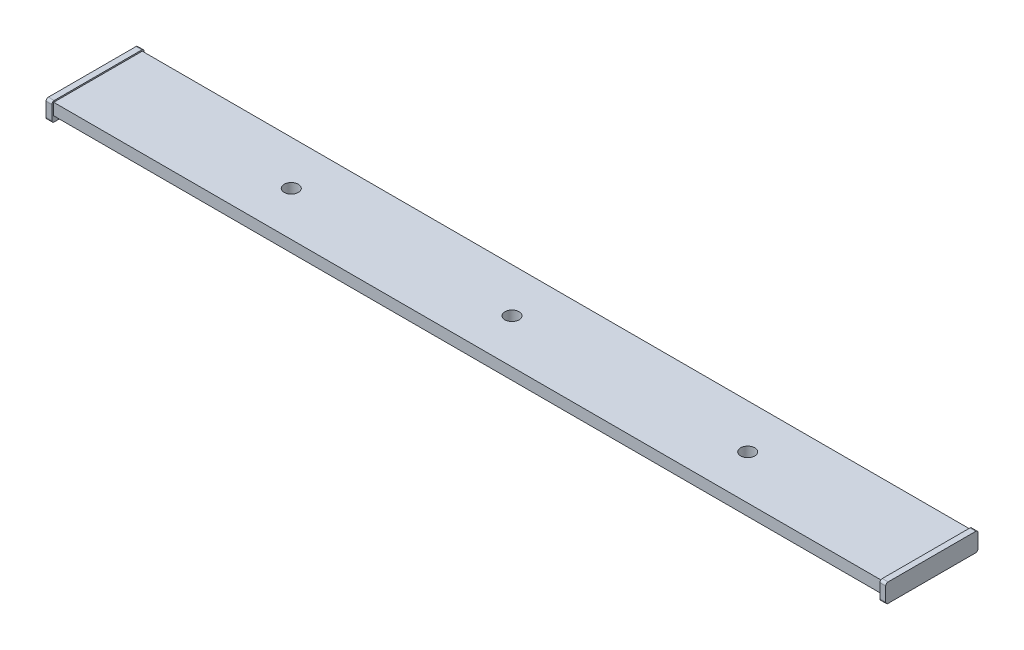
ISO-10303-21;
HEADER;
FILE_DESCRIPTION(('STEP AP214'),'2;1');
FILE_NAME('part.step','',(''),(''),'','','');
FILE_SCHEMA(('AUTOMOTIVE_DESIGN { 1 0 10303 214 1 1 1 1 }'));
ENDSEC;
DATA;
#1=APPLICATION_CONTEXT('core data for automotive mechanical design processes');
#2=APPLICATION_PROTOCOL_DEFINITION('international standard','automotive_design',2000,#1);
#3=PRODUCT_CONTEXT('',#1,'mechanical');
#4=PRODUCT('Part','Part','',(#3));
#5=PRODUCT_RELATED_PRODUCT_CATEGORY('part','',(#4));
#6=PRODUCT_DEFINITION_FORMATION('','',#4);
#7=PRODUCT_DEFINITION_CONTEXT('part definition',#1,'design');
#8=PRODUCT_DEFINITION('design','',#6,#7);
#9=PRODUCT_DEFINITION_SHAPE('','',#8);
#10=(LENGTH_UNIT() NAMED_UNIT(*) SI_UNIT(.MILLI.,.METRE.));
#11=(NAMED_UNIT(*) PLANE_ANGLE_UNIT() SI_UNIT($,.RADIAN.));
#12=(NAMED_UNIT(*) SI_UNIT($,.STERADIAN.) SOLID_ANGLE_UNIT());
#13=UNCERTAINTY_MEASURE_WITH_UNIT(LENGTH_MEASURE(1.E-05),#10,'distance_accuracy_value','');
#14=(GEOMETRIC_REPRESENTATION_CONTEXT(3) GLOBAL_UNCERTAINTY_ASSIGNED_CONTEXT((#13)) GLOBAL_UNIT_ASSIGNED_CONTEXT((#10,
#11,#12)) REPRESENTATION_CONTEXT('',''));
#15=CARTESIAN_POINT('',(0.,0.,0.));
#16=DIRECTION('',(0.,0.,1.));
#17=DIRECTION('',(1.,0.,0.));
#18=AXIS2_PLACEMENT_3D('',#15,#16,#17);
#19=CARTESIAN_POINT('',(0.,0.,0.));
#20=DIRECTION('',(0.,-1.,0.));
#21=DIRECTION('',(0.,0.,-1.));
#22=AXIS2_PLACEMENT_3D('',#19,#20,#21);
#23=PLANE('',#22);
#24=DIRECTION('',(1.,0.,0.));
#25=VECTOR('',#24,1.);
#26=CARTESIAN_POINT('',(-1800.,0.,189.84375));
#27=LINE('',#26,#25);
#28=CARTESIAN_POINT('',(-1775.,0.,189.84375));
#29=VERTEX_POINT('',#28);
#30=CARTESIAN_POINT('',(1775.,0.,189.84375));
#31=VERTEX_POINT('',#30);
#32=EDGE_CURVE('E547',#29,#31,#27,.T.);
#33=ORIENTED_EDGE('',*,*,#32,.F.);
#34=DIRECTION('',(0.,0.,-1.));
#35=VECTOR('',#34,1.);
#36=CARTESIAN_POINT('',(-1775.,0.,0.));
#37=LINE('',#36,#35);
#38=CARTESIAN_POINT('',(-1775.,0.,157.611800850735));
#39=VERTEX_POINT('',#38);
#40=EDGE_CURVE('E346',#29,#39,#37,.T.);
#41=ORIENTED_EDGE('',*,*,#40,.T.);
#42=DIRECTION('',(-1.,0.,0.));
#43=VECTOR('',#42,1.);
#44=CARTESIAN_POINT('',(0.,0.,157.611800850735));
#45=LINE('',#44,#43);
#46=CARTESIAN_POINT('',(1775.,0.,157.611800850736));
#47=VERTEX_POINT('',#46);
#48=EDGE_CURVE('E558',#47,#39,#45,.T.);
#49=ORIENTED_EDGE('',*,*,#48,.F.);
#50=DIRECTION('',(0.,0.,1.));
#51=VECTOR('',#50,1.);
#52=CARTESIAN_POINT('',(1775.,0.,0.));
#53=LINE('',#52,#51);
#54=EDGE_CURVE('E473',#47,#31,#53,.T.);
#55=ORIENTED_EDGE('',*,*,#54,.T.);
#56=EDGE_LOOP('',(#33,#41,#49,#55));
#57=FACE_BOUND('',#56,.T.);
#58=ADVANCED_FACE('F43',(#57),#23,.T.);
#59=DIRECTION('',(1.,0.,0.));
#60=VECTOR('',#59,1.);
#61=CARTESIAN_POINT('',(1853.85137292759,0.,-157.611800850736));
#62=LINE('',#61,#60);
#63=CARTESIAN_POINT('',(-1775.,0.,-157.611800850735));
#64=VERTEX_POINT('',#63);
#65=CARTESIAN_POINT('',(1775.,0.,-157.611800850736));
#66=VERTEX_POINT('',#65);
#67=EDGE_CURVE('E533',#64,#66,#62,.T.);
#68=ORIENTED_EDGE('',*,*,#67,.F.);
#69=DIRECTION('',(0.,0.,-1.));
#70=VECTOR('',#69,1.);
#71=CARTESIAN_POINT('',(-1775.,0.,0.));
#72=LINE('',#71,#70);
#73=CARTESIAN_POINT('',(-1775.,0.,-189.84375));
#74=VERTEX_POINT('',#73);
#75=EDGE_CURVE('E59',#64,#74,#72,.T.);
#76=ORIENTED_EDGE('',*,*,#75,.T.);
#77=DIRECTION('',(-1.,0.,0.));
#78=VECTOR('',#77,1.);
#79=CARTESIAN_POINT('',(-1800.,0.,-189.84375));
#80=LINE('',#79,#78);
#81=CARTESIAN_POINT('',(1775.,0.,-189.84375));
#82=VERTEX_POINT('',#81);
#83=EDGE_CURVE('E530',#82,#74,#80,.T.);
#84=ORIENTED_EDGE('',*,*,#83,.F.);
#85=DIRECTION('',(0.,0.,1.));
#86=VECTOR('',#85,1.);
#87=CARTESIAN_POINT('',(1775.,0.,0.));
#88=LINE('',#87,#86);
#89=EDGE_CURVE('E485',#82,#66,#88,.T.);
#90=ORIENTED_EDGE('',*,*,#89,.T.);
#91=EDGE_LOOP('',(#68,#76,#84,#90));
#92=FACE_BOUND('',#91,.T.);
#93=ADVANCED_FACE('F585',(#92),#23,.T.);
#94=CARTESIAN_POINT('',(-1800.,50.,-189.84375));
#95=DIRECTION('',(0.,0.,1.));
#96=DIRECTION('',(1.,0.,0.));
#97=AXIS2_PLACEMENT_3D('',#94,#95,#96);
#98=PLANE('',#97);
#99=DIRECTION('',(0.,-1.,0.));
#100=VECTOR('',#99,1.);
#101=CARTESIAN_POINT('',(-1775.,50.,-189.84375));
#102=LINE('',#101,#100);
#103=CARTESIAN_POINT('',(-1775.,50.,-189.84375));
#104=VERTEX_POINT('',#103);
#105=EDGE_CURVE('E361',#104,#74,#102,.T.);
#106=ORIENTED_EDGE('',*,*,#105,.F.);
#107=DIRECTION('',(-1.,0.,0.));
#108=VECTOR('',#107,1.);
#109=CARTESIAN_POINT('',(-1800.,50.,-189.84375));
#110=LINE('',#109,#108);
#111=CARTESIAN_POINT('',(1775.,50.,-189.84375));
#112=VERTEX_POINT('',#111);
#113=EDGE_CURVE('E542',#112,#104,#110,.T.);
#114=ORIENTED_EDGE('',*,*,#113,.F.);
#115=DIRECTION('',(0.,1.,0.));
#116=VECTOR('',#115,1.);
#117=CARTESIAN_POINT('',(1775.,50.,-189.84375));
#118=LINE('',#117,#116);
#119=EDGE_CURVE('E493',#82,#112,#118,.T.);
#120=ORIENTED_EDGE('',*,*,#119,.F.);
#121=ORIENTED_EDGE('',*,*,#83,.T.);
#122=EDGE_LOOP('',(#106,#114,#120,#121));
#123=FACE_BOUND('',#122,.T.);
#124=ADVANCED_FACE('F587',(#123),#98,.F.);
#125=CARTESIAN_POINT('',(-1800.,50.,189.84375));
#126=DIRECTION('',(0.,0.,-1.));
#127=DIRECTION('',(-1.,0.,0.));
#128=AXIS2_PLACEMENT_3D('',#125,#126,#127);
#129=PLANE('',#128);
#130=DIRECTION('',(0.,1.,0.));
#131=VECTOR('',#130,1.);
#132=CARTESIAN_POINT('',(-1775.,50.,189.84375));
#133=LINE('',#132,#131);
#134=CARTESIAN_POINT('',(-1775.,50.,189.84375));
#135=VERTEX_POINT('',#134);
#136=EDGE_CURVE('E67',#29,#135,#133,.T.);
#137=ORIENTED_EDGE('',*,*,#136,.F.);
#138=ORIENTED_EDGE('',*,*,#32,.T.);
#139=DIRECTION('',(0.,-1.,0.));
#140=VECTOR('',#139,1.);
#141=CARTESIAN_POINT('',(1775.,50.,189.84375));
#142=LINE('',#141,#140);
#143=CARTESIAN_POINT('',(1775.,50.,189.84375));
#144=VERTEX_POINT('',#143);
#145=EDGE_CURVE('E481',#144,#31,#142,.T.);
#146=ORIENTED_EDGE('',*,*,#145,.F.);
#147=DIRECTION('',(1.,0.,0.));
#148=VECTOR('',#147,1.);
#149=CARTESIAN_POINT('',(-1800.,50.,189.84375));
#150=LINE('',#149,#148);
#151=EDGE_CURVE('E546',#135,#144,#150,.T.);
#152=ORIENTED_EDGE('',*,*,#151,.F.);
#153=EDGE_LOOP('',(#137,#138,#146,#152));
#154=FACE_BOUND('',#153,.T.);
#155=ADVANCED_FACE('F593',(#154),#129,.F.);
#156=CARTESIAN_POINT('',(0.,50.,0.));
#157=DIRECTION('',(0.,-1.,0.));
#158=DIRECTION('',(0.,0.,-1.));
#159=AXIS2_PLACEMENT_3D('',#156,#157,#158);
#160=PLANE('',#159);
#161=CARTESIAN_POINT('',(1010.60365189735,50.,0.));
#162=DIRECTION('',(0.,-1.,0.));
#163=DIRECTION('',(0.,0.,-1.));
#164=AXIS2_PLACEMENT_3D('',#161,#162,#163);
#165=CIRCLE('',#164,30.3811390822481);
#166=CARTESIAN_POINT('',(1010.60365189735,50.,-30.3811390822481));
#167=VERTEX_POINT('',#166);
#168=EDGE_CURVE('E497',#167,#167,#165,.T.);
#169=ORIENTED_EDGE('',*,*,#168,.T.);
#170=EDGE_LOOP('',(#169));
#171=FACE_BOUND('',#170,.T.);
#172=CARTESIAN_POINT('',(-946.305515807381,50.,0.));
#173=DIRECTION('',(0.,-1.,0.));
#174=DIRECTION('',(0.,0.,-1.));
#175=AXIS2_PLACEMENT_3D('',#172,#173,#174);
#176=CIRCLE('',#175,30.3811390822481);
#177=CARTESIAN_POINT('',(-946.305515807381,50.,-30.3811390822481));
#178=VERTEX_POINT('',#177);
#179=EDGE_CURVE('E503',#178,#178,#176,.T.);
#180=ORIENTED_EDGE('',*,*,#179,.T.);
#181=EDGE_LOOP('',(#180));
#182=FACE_BOUND('',#181,.T.);
#183=CARTESIAN_POINT('',(0.,50.,0.));
#184=DIRECTION('',(0.,-1.,0.));
#185=DIRECTION('',(0.,0.,-1.));
#186=AXIS2_PLACEMENT_3D('',#183,#184,#185);
#187=CIRCLE('',#186,30.3811390822481);
#188=CARTESIAN_POINT('',(0.,50.,-30.3811390822481));
#189=VERTEX_POINT('',#188);
#190=EDGE_CURVE('E514',#189,#189,#187,.T.);
#191=ORIENTED_EDGE('',*,*,#190,.T.);
#192=EDGE_LOOP('',(#191));
#193=FACE_BOUND('',#192,.T.);
#194=DIRECTION('',(0.,0.,-1.));
#195=VECTOR('',#194,1.);
#196=CARTESIAN_POINT('',(-1775.,50.,0.));
#197=LINE('',#196,#195);
#198=EDGE_CURVE('E357',#135,#104,#197,.T.);
#199=ORIENTED_EDGE('',*,*,#198,.F.);
#200=ORIENTED_EDGE('',*,*,#151,.T.);
#201=DIRECTION('',(0.,0.,1.));
#202=VECTOR('',#201,1.);
#203=CARTESIAN_POINT('',(1775.,50.,0.));
#204=LINE('',#203,#202);
#205=EDGE_CURVE('E489',#112,#144,#204,.T.);
#206=ORIENTED_EDGE('',*,*,#205,.F.);
#207=ORIENTED_EDGE('',*,*,#113,.T.);
#208=EDGE_LOOP('',(#199,#200,#206,#207));
#209=FACE_BOUND('',#208,.T.);
#210=ADVANCED_FACE('F591',(#171,#182,#193,#209),#160,.F.);
#211=CARTESIAN_POINT('',(1010.60365189735,0.,0.));
#212=DIRECTION('',(0.,-1.,0.));
#213=DIRECTION('',(0.,0.,-1.));
#214=AXIS2_PLACEMENT_3D('',#211,#212,#213);
#215=CIRCLE('',#214,30.3811390822481);
#216=CARTESIAN_POINT('',(1010.60365189735,0.,-30.3811390822481));
#217=VERTEX_POINT('',#216);
#218=EDGE_CURVE('E507',#217,#217,#215,.T.);
#219=ORIENTED_EDGE('',*,*,#218,.F.);
#220=EDGE_LOOP('',(#219));
#221=FACE_BOUND('',#220,.T.);
#222=CARTESIAN_POINT('',(-946.305515807381,0.,0.));
#223=DIRECTION('',(0.,-1.,0.));
#224=DIRECTION('',(0.,0.,-1.));
#225=AXIS2_PLACEMENT_3D('',#222,#223,#224);
#226=CIRCLE('',#225,30.3811390822481);
#227=CARTESIAN_POINT('',(-946.305515807381,0.,-30.3811390822481));
#228=VERTEX_POINT('',#227);
#229=EDGE_CURVE('E498',#228,#228,#226,.T.);
#230=ORIENTED_EDGE('',*,*,#229,.F.);
#231=EDGE_LOOP('',(#230));
#232=FACE_BOUND('',#231,.T.);
#233=CARTESIAN_POINT('',(0.,0.,0.));
#234=DIRECTION('',(0.,-1.,0.));
#235=DIRECTION('',(0.,0.,-1.));
#236=AXIS2_PLACEMENT_3D('',#233,#234,#235);
#237=CIRCLE('',#236,30.3811390822481);
#238=CARTESIAN_POINT('',(0.,0.,-30.3811390822481));
#239=VERTEX_POINT('',#238);
#240=EDGE_CURVE('E502',#239,#239,#237,.T.);
#241=ORIENTED_EDGE('',*,*,#240,.F.);
#242=EDGE_LOOP('',(#241));
#243=FACE_BOUND('',#242,.T.);
#244=DIRECTION('',(1.,0.,0.));
#245=VECTOR('',#244,1.);
#246=CARTESIAN_POINT('',(1853.85137292759,0.,142.611800850736));
#247=LINE('',#246,#245);
#248=CARTESIAN_POINT('',(-1775.,0.,142.611800850735));
#249=VERTEX_POINT('',#248);
#250=CARTESIAN_POINT('',(1775.,0.,142.611800850736));
#251=VERTEX_POINT('',#250);
#252=EDGE_CURVE('E526',#249,#251,#247,.T.);
#253=ORIENTED_EDGE('',*,*,#252,.F.);
#254=DIRECTION('',(0.,0.,-1.));
#255=VECTOR('',#254,1.);
#256=CARTESIAN_POINT('',(-1775.,0.,0.));
#257=LINE('',#256,#255);
#258=CARTESIAN_POINT('',(-1775.,0.,-142.611800850735));
#259=VERTEX_POINT('',#258);
#260=EDGE_CURVE('E331',#249,#259,#257,.T.);
#261=ORIENTED_EDGE('',*,*,#260,.T.);
#262=DIRECTION('',(-1.,0.,0.));
#263=VECTOR('',#262,1.);
#264=CARTESIAN_POINT('',(0.,0.,-142.611800850735));
#265=LINE('',#264,#263);
#266=CARTESIAN_POINT('',(1775.,0.,-142.611800850736));
#267=VERTEX_POINT('',#266);
#268=EDGE_CURVE('E550',#267,#259,#265,.T.);
#269=ORIENTED_EDGE('',*,*,#268,.F.);
#270=DIRECTION('',(0.,0.,1.));
#271=VECTOR('',#270,1.);
#272=CARTESIAN_POINT('',(1775.,0.,0.));
#273=LINE('',#272,#271);
#274=EDGE_CURVE('E457',#267,#251,#273,.T.);
#275=ORIENTED_EDGE('',*,*,#274,.T.);
#276=EDGE_LOOP('',(#253,#261,#269,#275));
#277=FACE_BOUND('',#276,.T.);
#278=ADVANCED_FACE('F575',(#221,#232,#243,#277),#23,.T.);
#279=CARTESIAN_POINT('',(0.,25.,0.));
#280=DIRECTION('',(0.,1.,0.));
#281=DIRECTION('',(0.,0.,1.));
#282=AXIS2_PLACEMENT_3D('',#279,#280,#281);
#283=PLANE('',#282);
#284=DIRECTION('',(0.,0.,1.));
#285=VECTOR('',#284,1.);
#286=CARTESIAN_POINT('',(-1775.,25.,0.));
#287=LINE('',#286,#285);
#288=CARTESIAN_POINT('',(-1775.,25.,-157.611800850735));
#289=VERTEX_POINT('',#288);
#290=CARTESIAN_POINT('',(-1775.,25.,-142.611800850735));
#291=VERTEX_POINT('',#290);
#292=EDGE_CURVE('E342',#289,#291,#287,.T.);
#293=ORIENTED_EDGE('',*,*,#292,.F.);
#294=DIRECTION('',(1.,0.,0.));
#295=VECTOR('',#294,1.);
#296=CARTESIAN_POINT('',(1853.85137292759,25.,-157.611800850736));
#297=LINE('',#296,#295);
#298=CARTESIAN_POINT('',(1775.,25.,-157.611800850736));
#299=VERTEX_POINT('',#298);
#300=EDGE_CURVE('E536',#289,#299,#297,.T.);
#301=ORIENTED_EDGE('',*,*,#300,.T.);
#302=DIRECTION('',(0.,0.,-1.));
#303=VECTOR('',#302,1.);
#304=CARTESIAN_POINT('',(1775.,25.,0.));
#305=LINE('',#304,#303);
#306=CARTESIAN_POINT('',(1775.,25.,-142.611800850736));
#307=VERTEX_POINT('',#306);
#308=EDGE_CURVE('E469',#307,#299,#305,.T.);
#309=ORIENTED_EDGE('',*,*,#308,.F.);
#310=DIRECTION('',(-1.,0.,0.));
#311=VECTOR('',#310,1.);
#312=CARTESIAN_POINT('',(1853.85137292759,25.,-142.611800850736));
#313=LINE('',#312,#311);
#314=EDGE_CURVE('E518',#307,#291,#313,.T.);
#315=ORIENTED_EDGE('',*,*,#314,.T.);
#316=EDGE_LOOP('',(#293,#301,#309,#315));
#317=FACE_BOUND('',#316,.T.);
#318=ADVANCED_FACE('F581',(#317),#283,.F.);
#319=CARTESIAN_POINT('',(1853.85137292759,25.,-157.611800850736));
#320=DIRECTION('',(0.,0.,-1.));
#321=DIRECTION('',(-1.,0.,0.));
#322=AXIS2_PLACEMENT_3D('',#319,#320,#321);
#323=PLANE('',#322);
#324=DIRECTION('',(0.,1.,0.));
#325=VECTOR('',#324,1.);
#326=CARTESIAN_POINT('',(-1775.,25.,-157.611800850735));
#327=LINE('',#326,#325);
#328=EDGE_CURVE('E349',#64,#289,#327,.T.);
#329=ORIENTED_EDGE('',*,*,#328,.F.);
#330=ORIENTED_EDGE('',*,*,#67,.T.);
#331=DIRECTION('',(0.,-1.,0.));
#332=VECTOR('',#331,1.);
#333=CARTESIAN_POINT('',(1775.,25.,-157.611800850736));
#334=LINE('',#333,#332);
#335=EDGE_CURVE('E477',#299,#66,#334,.T.);
#336=ORIENTED_EDGE('',*,*,#335,.F.);
#337=ORIENTED_EDGE('',*,*,#300,.F.);
#338=EDGE_LOOP('',(#329,#330,#336,#337));
#339=FACE_BOUND('',#338,.T.);
#340=ADVANCED_FACE('F584',(#339),#323,.F.);
#341=CARTESIAN_POINT('',(1853.85137292759,25.,-142.611800850736));
#342=DIRECTION('',(0.,0.,1.));
#343=DIRECTION('',(1.,0.,0.));
#344=AXIS2_PLACEMENT_3D('',#341,#342,#343);
#345=PLANE('',#344);
#346=DIRECTION('',(0.,-1.,0.));
#347=VECTOR('',#346,1.);
#348=CARTESIAN_POINT('',(-1775.,25.,-142.611800850735));
#349=LINE('',#348,#347);
#350=EDGE_CURVE('E338',#291,#259,#349,.T.);
#351=ORIENTED_EDGE('',*,*,#350,.F.);
#352=ORIENTED_EDGE('',*,*,#314,.F.);
#353=DIRECTION('',(0.,1.,0.));
#354=VECTOR('',#353,1.);
#355=CARTESIAN_POINT('',(1775.,25.,-142.611800850736));
#356=LINE('',#355,#354);
#357=EDGE_CURVE('E465',#267,#307,#356,.T.);
#358=ORIENTED_EDGE('',*,*,#357,.F.);
#359=ORIENTED_EDGE('',*,*,#268,.T.);
#360=EDGE_LOOP('',(#351,#352,#358,#359));
#361=FACE_BOUND('',#360,.T.);
#362=ADVANCED_FACE('F577',(#361),#345,.F.);
#363=CARTESIAN_POINT('',(0.,25.,0.));
#364=DIRECTION('',(0.,1.,0.));
#365=DIRECTION('',(0.,0.,1.));
#366=AXIS2_PLACEMENT_3D('',#363,#364,#365);
#367=PLANE('',#366);
#368=DIRECTION('',(0.,0.,1.));
#369=VECTOR('',#368,1.);
#370=CARTESIAN_POINT('',(-1775.,25.,0.));
#371=LINE('',#370,#369);
#372=CARTESIAN_POINT('',(-1775.,25.,142.611800850735));
#373=VERTEX_POINT('',#372);
#374=CARTESIAN_POINT('',(-1775.,25.,157.611800850735));
#375=VERTEX_POINT('',#374);
#376=EDGE_CURVE('E305',#373,#375,#371,.T.);
#377=ORIENTED_EDGE('',*,*,#376,.F.);
#378=DIRECTION('',(1.,0.,0.));
#379=VECTOR('',#378,1.);
#380=CARTESIAN_POINT('',(1853.85137292759,25.,142.611800850736));
#381=LINE('',#380,#379);
#382=CARTESIAN_POINT('',(1775.,25.,142.611800850736));
#383=VERTEX_POINT('',#382);
#384=EDGE_CURVE('E522',#373,#383,#381,.T.);
#385=ORIENTED_EDGE('',*,*,#384,.T.);
#386=DIRECTION('',(0.,0.,-1.));
#387=VECTOR('',#386,1.);
#388=CARTESIAN_POINT('',(1775.,25.,0.));
#389=LINE('',#388,#387);
#390=CARTESIAN_POINT('',(1775.,25.,157.611800850736));
#391=VERTEX_POINT('',#390);
#392=EDGE_CURVE('E433',#391,#383,#389,.T.);
#393=ORIENTED_EDGE('',*,*,#392,.F.);
#394=DIRECTION('',(-1.,0.,0.));
#395=VECTOR('',#394,1.);
#396=CARTESIAN_POINT('',(1853.85137292759,25.,157.611800850736));
#397=LINE('',#396,#395);
#398=EDGE_CURVE('E525',#391,#375,#397,.T.);
#399=ORIENTED_EDGE('',*,*,#398,.T.);
#400=EDGE_LOOP('',(#377,#385,#393,#399));
#401=FACE_BOUND('',#400,.T.);
#402=ADVANCED_FACE('F601',(#401),#367,.F.);
#403=CARTESIAN_POINT('',(1853.85137292759,25.,157.611800850736));
#404=DIRECTION('',(0.,0.,1.));
#405=DIRECTION('',(1.,0.,0.));
#406=AXIS2_PLACEMENT_3D('',#403,#404,#405);
#407=PLANE('',#406);
#408=DIRECTION('',(0.,-1.,0.));
#409=VECTOR('',#408,1.);
#410=CARTESIAN_POINT('',(-1775.,25.,157.611800850735));
#411=LINE('',#410,#409);
#412=EDGE_CURVE('E334',#375,#39,#411,.T.);
#413=ORIENTED_EDGE('',*,*,#412,.F.);
#414=ORIENTED_EDGE('',*,*,#398,.F.);
#415=DIRECTION('',(0.,1.,0.));
#416=VECTOR('',#415,1.);
#417=CARTESIAN_POINT('',(1775.,25.,157.611800850736));
#418=LINE('',#417,#416);
#419=EDGE_CURVE('E461',#47,#391,#418,.T.);
#420=ORIENTED_EDGE('',*,*,#419,.F.);
#421=ORIENTED_EDGE('',*,*,#48,.T.);
#422=EDGE_LOOP('',(#413,#414,#420,#421));
#423=FACE_BOUND('',#422,.T.);
#424=ADVANCED_FACE('F598',(#423),#407,.F.);
#425=CARTESIAN_POINT('',(1853.85137292759,25.,142.611800850736));
#426=DIRECTION('',(0.,0.,-1.));
#427=DIRECTION('',(-1.,0.,0.));
#428=AXIS2_PLACEMENT_3D('',#425,#426,#427);
#429=PLANE('',#428);
#430=DIRECTION('',(0.,1.,0.));
#431=VECTOR('',#430,1.);
#432=CARTESIAN_POINT('',(-1775.,25.,142.611800850735));
#433=LINE('',#432,#431);
#434=EDGE_CURVE('E11',#249,#373,#433,.T.);
#435=ORIENTED_EDGE('',*,*,#434,.F.);
#436=ORIENTED_EDGE('',*,*,#252,.T.);
#437=DIRECTION('',(0.,-1.,0.));
#438=VECTOR('',#437,1.);
#439=CARTESIAN_POINT('',(1775.,25.,142.611800850736));
#440=LINE('',#439,#438);
#441=EDGE_CURVE('E52',#383,#251,#440,.T.);
#442=ORIENTED_EDGE('',*,*,#441,.F.);
#443=ORIENTED_EDGE('',*,*,#384,.F.);
#444=EDGE_LOOP('',(#435,#436,#442,#443));
#445=FACE_BOUND('',#444,.T.);
#446=ADVANCED_FACE('F569',(#445),#429,.F.);
#447=CARTESIAN_POINT('',(0.,50.,0.));
#448=DIRECTION('',(0.,-1.,0.));
#449=DIRECTION('',(0.,0.,-1.));
#450=AXIS2_PLACEMENT_3D('',#447,#448,#449);
#451=CYLINDRICAL_SURFACE('',#450,30.3811390822481);
#452=ORIENTED_EDGE('',*,*,#190,.F.);
#453=EDGE_LOOP('',(#452));
#454=FACE_BOUND('',#453,.T.);
#455=ORIENTED_EDGE('',*,*,#240,.T.);
#456=EDGE_LOOP('',(#455));
#457=FACE_BOUND('',#456,.T.);
#458=ADVANCED_FACE('F632',(#454,#457),#451,.F.);
#459=CARTESIAN_POINT('',(-946.305515807381,50.,0.));
#460=DIRECTION('',(0.,-1.,0.));
#461=DIRECTION('',(0.,0.,-1.));
#462=AXIS2_PLACEMENT_3D('',#459,#460,#461);
#463=CYLINDRICAL_SURFACE('',#462,30.3811390822481);
#464=ORIENTED_EDGE('',*,*,#179,.F.);
#465=EDGE_LOOP('',(#464));
#466=FACE_BOUND('',#465,.T.);
#467=ORIENTED_EDGE('',*,*,#229,.T.);
#468=EDGE_LOOP('',(#467));
#469=FACE_BOUND('',#468,.T.);
#470=ADVANCED_FACE('F634',(#466,#469),#463,.F.);
#471=CARTESIAN_POINT('',(1010.60365189735,50.,0.));
#472=DIRECTION('',(0.,-1.,0.));
#473=DIRECTION('',(0.,0.,-1.));
#474=AXIS2_PLACEMENT_3D('',#471,#472,#473);
#475=CYLINDRICAL_SURFACE('',#474,30.3811390822481);
#476=ORIENTED_EDGE('',*,*,#168,.F.);
#477=EDGE_LOOP('',(#476));
#478=FACE_BOUND('',#477,.T.);
#479=ORIENTED_EDGE('',*,*,#218,.T.);
#480=EDGE_LOOP('',(#479));
#481=FACE_BOUND('',#480,.T.);
#482=ADVANCED_FACE('F640',(#478,#481),#475,.F.);
#483=CARTESIAN_POINT('',(1775.,-14.1904561773228,-187.814440115148));
#484=DIRECTION('',(1.,0.,0.));
#485=DIRECTION('',(0.,0.,-1.));
#486=AXIS2_PLACEMENT_3D('',#483,#484,#485);
#487=PLANE('',#486);
#488=CARTESIAN_POINT('',(1775.,-14.1904561773228,-187.814440115148));
#489=DIRECTION('',(1.,0.,0.));
#490=DIRECTION('',(0.,0.,-1.));
#491=AXIS2_PLACEMENT_3D('',#488,#489,#490);
#492=CIRCLE('',#491,9.99999999999999);
#493=CARTESIAN_POINT('',(1775.,-24.1904561773228,-187.814440115148));
#494=VERTEX_POINT('',#493);
#495=CARTESIAN_POINT('',(1775.,-14.1904561773228,-197.814440115148));
#496=VERTEX_POINT('',#495);
#497=EDGE_CURVE('E366',#494,#496,#492,.T.);
#498=ORIENTED_EDGE('',*,*,#497,.F.);
#499=DIRECTION('',(0.,0.,-1.));
#500=VECTOR('',#499,1.);
#501=CARTESIAN_POINT('',(1775.,-24.1904561773228,187.814440115148));
#502=LINE('',#501,#500);
#503=CARTESIAN_POINT('',(1775.,-24.1904561773228,187.814440115148));
#504=VERTEX_POINT('',#503);
#505=EDGE_CURVE('E395',#504,#494,#502,.T.);
#506=ORIENTED_EDGE('',*,*,#505,.F.);
#507=CARTESIAN_POINT('',(1775.,-14.1904561773228,187.814440115148));
#508=DIRECTION('',(1.,0.,0.));
#509=DIRECTION('',(0.,0.,1.));
#510=AXIS2_PLACEMENT_3D('',#507,#508,#509);
#511=CIRCLE('',#510,10.);
#512=CARTESIAN_POINT('',(1775.,-14.1904561773228,197.814440115148));
#513=VERTEX_POINT('',#512);
#514=EDGE_CURVE('E391',#513,#504,#511,.T.);
#515=ORIENTED_EDGE('',*,*,#514,.F.);
#516=DIRECTION('',(0.,-1.,0.));
#517=VECTOR('',#516,1.);
#518=CARTESIAN_POINT('',(1775.,-14.1904561773228,197.814440115148));
#519=LINE('',#518,#517);
#520=CARTESIAN_POINT('',(1775.,45.6811638734017,197.814440115148));
#521=VERTEX_POINT('',#520);
#522=EDGE_CURVE('E387',#521,#513,#519,.T.);
#523=ORIENTED_EDGE('',*,*,#522,.F.);
#524=CARTESIAN_POINT('',(1775.,45.6811638734017,187.814440115148));
#525=DIRECTION('',(1.,0.,0.));
#526=DIRECTION('',(0.,0.,1.));
#527=AXIS2_PLACEMENT_3D('',#524,#525,#526);
#528=CIRCLE('',#527,10.);
#529=CARTESIAN_POINT('',(1775.,55.6811638734017,187.814440115148));
#530=VERTEX_POINT('',#529);
#531=EDGE_CURVE('E383',#530,#521,#528,.T.);
#532=ORIENTED_EDGE('',*,*,#531,.F.);
#533=DIRECTION('',(0.,0.,1.));
#534=VECTOR('',#533,1.);
#535=CARTESIAN_POINT('',(1775.,55.6811638734017,187.814440115148));
#536=LINE('',#535,#534);
#537=CARTESIAN_POINT('',(1775.,55.6811638734017,-187.814440115148));
#538=VERTEX_POINT('',#537);
#539=EDGE_CURVE('E379',#538,#530,#536,.T.);
#540=ORIENTED_EDGE('',*,*,#539,.F.);
#541=CARTESIAN_POINT('',(1775.,45.6811638734017,-187.814440115148));
#542=DIRECTION('',(1.,0.,0.));
#543=DIRECTION('',(0.,0.,1.));
#544=AXIS2_PLACEMENT_3D('',#541,#542,#543);
#545=CIRCLE('',#544,10.);
#546=CARTESIAN_POINT('',(1775.,45.6811638734017,-197.814440115148));
#547=VERTEX_POINT('',#546);
#548=EDGE_CURVE('E375',#547,#538,#545,.T.);
#549=ORIENTED_EDGE('',*,*,#548,.F.);
#550=DIRECTION('',(0.,1.,0.));
#551=VECTOR('',#550,1.);
#552=CARTESIAN_POINT('',(1775.,-14.1904561773228,-197.814440115148));
#553=LINE('',#552,#551);
#554=EDGE_CURVE('E370',#496,#547,#553,.T.);
#555=ORIENTED_EDGE('',*,*,#554,.F.);
#556=EDGE_LOOP('',(#498,#506,#515,#523,#532,#540,#549,#555));
#557=FACE_BOUND('',#556,.T.);
#558=ORIENTED_EDGE('',*,*,#89,.F.);
#559=ORIENTED_EDGE('',*,*,#119,.T.);
#560=ORIENTED_EDGE('',*,*,#205,.T.);
#561=ORIENTED_EDGE('',*,*,#145,.T.);
#562=ORIENTED_EDGE('',*,*,#54,.F.);
#563=ORIENTED_EDGE('',*,*,#419,.T.);
#564=ORIENTED_EDGE('',*,*,#392,.T.);
#565=ORIENTED_EDGE('',*,*,#441,.T.);
#566=ORIENTED_EDGE('',*,*,#274,.F.);
#567=ORIENTED_EDGE('',*,*,#357,.T.);
#568=ORIENTED_EDGE('',*,*,#308,.T.);
#569=ORIENTED_EDGE('',*,*,#335,.T.);
#570=EDGE_LOOP('',(#558,#559,#560,#561,#562,#563,#564,#565,#566,#567,#568,#569));
#571=FACE_BOUND('',#570,.T.);
#572=ADVANCED_FACE('F567',(#557,#571),#487,.F.);
#573=CARTESIAN_POINT('',(1775.,-14.1904561773228,-187.814440115148));
#574=DIRECTION('',(1.,0.,0.));
#575=DIRECTION('',(0.,0.,-1.));
#576=AXIS2_PLACEMENT_3D('',#573,#574,#575);
#577=CYLINDRICAL_SURFACE('',#576,9.99999999999999);
#578=CARTESIAN_POINT('',(1800.,-14.1904561773228,-187.814440115148));
#579=DIRECTION('',(1.,0.,0.));
#580=DIRECTION('',(0.,0.,-1.));
#581=AXIS2_PLACEMENT_3D('',#578,#579,#580);
#582=CIRCLE('',#581,9.99999999999999);
#583=CARTESIAN_POINT('',(1800.,-24.1904561773228,-187.814440115148));
#584=VERTEX_POINT('',#583);
#585=CARTESIAN_POINT('',(1800.,-14.1904561773228,-197.814440115148));
#586=VERTEX_POINT('',#585);
#587=EDGE_CURVE('E365',#584,#586,#582,.T.);
#588=ORIENTED_EDGE('',*,*,#587,.F.);
#589=DIRECTION('',(1.,0.,0.));
#590=VECTOR('',#589,1.);
#591=CARTESIAN_POINT('',(1775.,-24.1904561773228,-187.814440115148));
#592=LINE('',#591,#590);
#593=EDGE_CURVE('E430',#494,#584,#592,.T.);
#594=ORIENTED_EDGE('',*,*,#593,.F.);
#595=ORIENTED_EDGE('',*,*,#497,.T.);
#596=DIRECTION('',(1.,0.,0.));
#597=VECTOR('',#596,1.);
#598=CARTESIAN_POINT('',(1775.,-14.1904561773228,-197.814440115148));
#599=LINE('',#598,#597);
#600=EDGE_CURVE('E399',#496,#586,#599,.T.);
#601=ORIENTED_EDGE('',*,*,#600,.T.);
#602=EDGE_LOOP('',(#588,#594,#595,#601));
#603=FACE_BOUND('',#602,.T.);
#604=ADVANCED_FACE('F649',(#603),#577,.T.);
#605=CARTESIAN_POINT('',(1775.,-24.1904561773228,187.814440115148));
#606=DIRECTION('',(0.,-1.,0.));
#607=DIRECTION('',(0.,0.,-1.));
#608=AXIS2_PLACEMENT_3D('',#605,#606,#607);
#609=PLANE('',#608);
#610=DIRECTION('',(0.,0.,-1.));
#611=VECTOR('',#610,1.);
#612=CARTESIAN_POINT('',(1800.,-24.1904561773228,187.814440115148));
#613=LINE('',#612,#611);
#614=CARTESIAN_POINT('',(1800.,-24.1904561773228,187.814440115148));
#615=VERTEX_POINT('',#614);
#616=EDGE_CURVE('E371',#615,#584,#613,.T.);
#617=ORIENTED_EDGE('',*,*,#616,.F.);
#618=DIRECTION('',(1.,0.,0.));
#619=VECTOR('',#618,1.);
#620=CARTESIAN_POINT('',(1775.,-24.1904561773228,187.814440115148));
#621=LINE('',#620,#619);
#622=EDGE_CURVE('E434',#504,#615,#621,.T.);
#623=ORIENTED_EDGE('',*,*,#622,.F.);
#624=ORIENTED_EDGE('',*,*,#505,.T.);
#625=ORIENTED_EDGE('',*,*,#593,.T.);
#626=EDGE_LOOP('',(#617,#623,#624,#625));
#627=FACE_BOUND('',#626,.T.);
#628=ADVANCED_FACE('F652',(#627),#609,.T.);
#629=CARTESIAN_POINT('',(1775.,-14.1904561773228,187.814440115148));
#630=DIRECTION('',(1.,0.,0.));
#631=DIRECTION('',(0.,0.,-1.));
#632=AXIS2_PLACEMENT_3D('',#629,#630,#631);
#633=CYLINDRICAL_SURFACE('',#632,10.);
#634=CARTESIAN_POINT('',(1800.,-14.1904561773228,187.814440115148));
#635=DIRECTION('',(1.,0.,0.));
#636=DIRECTION('',(0.,0.,1.));
#637=AXIS2_PLACEMENT_3D('',#634,#635,#636);
#638=CIRCLE('',#637,10.);
#639=CARTESIAN_POINT('',(1800.,-14.1904561773228,197.814440115148));
#640=VERTEX_POINT('',#639);
#641=EDGE_CURVE('E423',#640,#615,#638,.T.);
#642=ORIENTED_EDGE('',*,*,#641,.F.);
#643=DIRECTION('',(1.,0.,0.));
#644=VECTOR('',#643,1.);
#645=CARTESIAN_POINT('',(1775.,-14.1904561773228,197.814440115148));
#646=LINE('',#645,#644);
#647=EDGE_CURVE('E437',#513,#640,#646,.T.);
#648=ORIENTED_EDGE('',*,*,#647,.F.);
#649=ORIENTED_EDGE('',*,*,#514,.T.);
#650=ORIENTED_EDGE('',*,*,#622,.T.);
#651=EDGE_LOOP('',(#642,#648,#649,#650));
#652=FACE_BOUND('',#651,.T.);
#653=ADVANCED_FACE('F673',(#652),#633,.T.);
#654=CARTESIAN_POINT('',(1775.,-14.1904561773228,197.814440115148));
#655=DIRECTION('',(0.,0.,1.));
#656=DIRECTION('',(1.,0.,0.));
#657=AXIS2_PLACEMENT_3D('',#654,#655,#656);
#658=PLANE('',#657);
#659=DIRECTION('',(0.,-1.,0.));
#660=VECTOR('',#659,1.);
#661=CARTESIAN_POINT('',(1800.,-14.1904561773228,197.814440115148));
#662=LINE('',#661,#660);
#663=CARTESIAN_POINT('',(1800.,45.6811638734017,197.814440115148));
#664=VERTEX_POINT('',#663);
#665=EDGE_CURVE('E419',#664,#640,#662,.T.);
#666=ORIENTED_EDGE('',*,*,#665,.F.);
#667=DIRECTION('',(1.,0.,0.));
#668=VECTOR('',#667,1.);
#669=CARTESIAN_POINT('',(1775.,45.6811638734017,197.814440115148));
#670=LINE('',#669,#668);
#671=EDGE_CURVE('E440',#521,#664,#670,.T.);
#672=ORIENTED_EDGE('',*,*,#671,.F.);
#673=ORIENTED_EDGE('',*,*,#522,.T.);
#674=ORIENTED_EDGE('',*,*,#647,.T.);
#675=EDGE_LOOP('',(#666,#672,#673,#674));
#676=FACE_BOUND('',#675,.T.);
#677=ADVANCED_FACE('F669',(#676),#658,.T.);
#678=CARTESIAN_POINT('',(1775.,45.6811638734017,187.814440115148));
#679=DIRECTION('',(1.,0.,0.));
#680=DIRECTION('',(0.,0.,-1.));
#681=AXIS2_PLACEMENT_3D('',#678,#679,#680);
#682=CYLINDRICAL_SURFACE('',#681,10.);
#683=CARTESIAN_POINT('',(1800.,45.6811638734017,187.814440115148));
#684=DIRECTION('',(1.,0.,0.));
#685=DIRECTION('',(0.,0.,1.));
#686=AXIS2_PLACEMENT_3D('',#683,#684,#685);
#687=CIRCLE('',#686,10.);
#688=CARTESIAN_POINT('',(1800.,55.6811638734017,187.814440115148));
#689=VERTEX_POINT('',#688);
#690=EDGE_CURVE('E415',#689,#664,#687,.T.);
#691=ORIENTED_EDGE('',*,*,#690,.F.);
#692=DIRECTION('',(1.,0.,0.));
#693=VECTOR('',#692,1.);
#694=CARTESIAN_POINT('',(1775.,55.6811638734017,187.814440115148));
#695=LINE('',#694,#693);
#696=EDGE_CURVE('E443',#530,#689,#695,.T.);
#697=ORIENTED_EDGE('',*,*,#696,.F.);
#698=ORIENTED_EDGE('',*,*,#531,.T.);
#699=ORIENTED_EDGE('',*,*,#671,.T.);
#700=EDGE_LOOP('',(#691,#697,#698,#699));
#701=FACE_BOUND('',#700,.T.);
#702=ADVANCED_FACE('F665',(#701),#682,.T.);
#703=CARTESIAN_POINT('',(1775.,55.6811638734017,187.814440115148));
#704=DIRECTION('',(0.,1.,0.));
#705=DIRECTION('',(0.,0.,1.));
#706=AXIS2_PLACEMENT_3D('',#703,#704,#705);
#707=PLANE('',#706);
#708=DIRECTION('',(0.,0.,1.));
#709=VECTOR('',#708,1.);
#710=CARTESIAN_POINT('',(1800.,55.6811638734017,187.814440115148));
#711=LINE('',#710,#709);
#712=CARTESIAN_POINT('',(1800.,55.6811638734017,-187.814440115148));
#713=VERTEX_POINT('',#712);
#714=EDGE_CURVE('E411',#713,#689,#711,.T.);
#715=ORIENTED_EDGE('',*,*,#714,.F.);
#716=DIRECTION('',(1.,0.,0.));
#717=VECTOR('',#716,1.);
#718=CARTESIAN_POINT('',(1775.,55.6811638734017,-187.814440115148));
#719=LINE('',#718,#717);
#720=EDGE_CURVE('E446',#538,#713,#719,.T.);
#721=ORIENTED_EDGE('',*,*,#720,.F.);
#722=ORIENTED_EDGE('',*,*,#539,.T.);
#723=ORIENTED_EDGE('',*,*,#696,.T.);
#724=EDGE_LOOP('',(#715,#721,#722,#723));
#725=FACE_BOUND('',#724,.T.);
#726=ADVANCED_FACE('F661',(#725),#707,.T.);
#727=CARTESIAN_POINT('',(1775.,45.6811638734017,-187.814440115148));
#728=DIRECTION('',(1.,0.,0.));
#729=DIRECTION('',(0.,0.,-1.));
#730=AXIS2_PLACEMENT_3D('',#727,#728,#729);
#731=CYLINDRICAL_SURFACE('',#730,10.);
#732=CARTESIAN_POINT('',(1800.,45.6811638734017,-187.814440115148));
#733=DIRECTION('',(1.,0.,0.));
#734=DIRECTION('',(0.,0.,1.));
#735=AXIS2_PLACEMENT_3D('',#732,#733,#734);
#736=CIRCLE('',#735,10.);
#737=CARTESIAN_POINT('',(1800.,45.6811638734017,-197.814440115148));
#738=VERTEX_POINT('',#737);
#739=EDGE_CURVE('E407',#738,#713,#736,.T.);
#740=ORIENTED_EDGE('',*,*,#739,.F.);
#741=DIRECTION('',(1.,0.,0.));
#742=VECTOR('',#741,1.);
#743=CARTESIAN_POINT('',(1775.,45.6811638734017,-197.814440115148));
#744=LINE('',#743,#742);
#745=EDGE_CURVE('E449',#547,#738,#744,.T.);
#746=ORIENTED_EDGE('',*,*,#745,.F.);
#747=ORIENTED_EDGE('',*,*,#548,.T.);
#748=ORIENTED_EDGE('',*,*,#720,.T.);
#749=EDGE_LOOP('',(#740,#746,#747,#748));
#750=FACE_BOUND('',#749,.T.);
#751=ADVANCED_FACE('F657',(#750),#731,.T.);
#752=CARTESIAN_POINT('',(1775.,-14.1904561773228,-197.814440115148));
#753=DIRECTION('',(0.,0.,-1.));
#754=DIRECTION('',(-1.,0.,0.));
#755=AXIS2_PLACEMENT_3D('',#752,#753,#754);
#756=PLANE('',#755);
#757=DIRECTION('',(0.,1.,0.));
#758=VECTOR('',#757,1.);
#759=CARTESIAN_POINT('',(1800.,-14.1904561773228,-197.814440115148));
#760=LINE('',#759,#758);
#761=EDGE_CURVE('E403',#586,#738,#760,.T.);
#762=ORIENTED_EDGE('',*,*,#761,.F.);
#763=ORIENTED_EDGE('',*,*,#600,.F.);
#764=ORIENTED_EDGE('',*,*,#554,.T.);
#765=ORIENTED_EDGE('',*,*,#745,.T.);
#766=EDGE_LOOP('',(#762,#763,#764,#765));
#767=FACE_BOUND('',#766,.T.);
#768=ADVANCED_FACE('F654',(#767),#756,.T.);
#769=CARTESIAN_POINT('',(1800.,50.,189.84375));
#770=DIRECTION('',(-1.,0.,0.));
#771=DIRECTION('',(0.,0.,1.));
#772=AXIS2_PLACEMENT_3D('',#769,#770,#771);
#773=PLANE('',#772);
#774=ORIENTED_EDGE('',*,*,#587,.T.);
#775=ORIENTED_EDGE('',*,*,#761,.T.);
#776=ORIENTED_EDGE('',*,*,#739,.T.);
#777=ORIENTED_EDGE('',*,*,#714,.T.);
#778=ORIENTED_EDGE('',*,*,#690,.T.);
#779=ORIENTED_EDGE('',*,*,#665,.T.);
#780=ORIENTED_EDGE('',*,*,#641,.T.);
#781=ORIENTED_EDGE('',*,*,#616,.T.);
#782=EDGE_LOOP('',(#774,#775,#776,#777,#778,#779,#780,#781));
#783=FACE_BOUND('',#782,.T.);
#784=ADVANCED_FACE('F45',(#783),#773,.F.);
#785=CARTESIAN_POINT('',(-1775.,-14.1904561773228,-187.814440115148));
#786=DIRECTION('',(-1.,0.,0.));
#787=DIRECTION('',(0.,0.,-1.));
#788=AXIS2_PLACEMENT_3D('',#785,#786,#787);
#789=PLANE('',#788);
#790=CARTESIAN_POINT('',(-1775.,-14.1904561773228,-187.814440115148));
#791=DIRECTION('',(1.,0.,0.));
#792=DIRECTION('',(0.,0.,-1.));
#793=AXIS2_PLACEMENT_3D('',#790,#791,#792);
#794=CIRCLE('',#793,9.99999999999999);
#795=CARTESIAN_POINT('',(-1775.,-24.1904561773228,-187.814440115148));
#796=VERTEX_POINT('',#795);
#797=CARTESIAN_POINT('',(-1775.,-14.1904561773228,-197.814440115148));
#798=VERTEX_POINT('',#797);
#799=EDGE_CURVE('E237',#796,#798,#794,.T.);
#800=ORIENTED_EDGE('',*,*,#799,.T.);
#801=DIRECTION('',(0.,1.,0.));
#802=VECTOR('',#801,1.);
#803=CARTESIAN_POINT('',(-1775.,-14.1904561773228,-197.814440115148));
#804=LINE('',#803,#802);
#805=CARTESIAN_POINT('',(-1775.,45.6811638734017,-197.814440115148));
#806=VERTEX_POINT('',#805);
#807=EDGE_CURVE('E256',#798,#806,#804,.T.);
#808=ORIENTED_EDGE('',*,*,#807,.T.);
#809=CARTESIAN_POINT('',(-1775.,45.6811638734017,-187.814440115148));
#810=DIRECTION('',(1.,0.,0.));
#811=DIRECTION('',(0.,0.,1.));
#812=AXIS2_PLACEMENT_3D('',#809,#810,#811);
#813=CIRCLE('',#812,10.);
#814=CARTESIAN_POINT('',(-1775.,55.6811638734017,-187.814440115148));
#815=VERTEX_POINT('',#814);
#816=EDGE_CURVE('E279',#806,#815,#813,.T.);
#817=ORIENTED_EDGE('',*,*,#816,.T.);
#818=DIRECTION('',(0.,0.,1.));
#819=VECTOR('',#818,1.);
#820=CARTESIAN_POINT('',(-1775.,55.6811638734017,187.814440115148));
#821=LINE('',#820,#819);
#822=CARTESIAN_POINT('',(-1775.,55.6811638734017,187.814440115148));
#823=VERTEX_POINT('',#822);
#824=EDGE_CURVE('E276',#815,#823,#821,.T.);
#825=ORIENTED_EDGE('',*,*,#824,.T.);
#826=CARTESIAN_POINT('',(-1775.,45.6811638734017,187.814440115148));
#827=DIRECTION('',(1.,0.,0.));
#828=DIRECTION('',(0.,0.,1.));
#829=AXIS2_PLACEMENT_3D('',#826,#827,#828);
#830=CIRCLE('',#829,10.);
#831=CARTESIAN_POINT('',(-1775.,45.6811638734017,197.814440115148));
#832=VERTEX_POINT('',#831);
#833=EDGE_CURVE('E273',#823,#832,#830,.T.);
#834=ORIENTED_EDGE('',*,*,#833,.T.);
#835=DIRECTION('',(0.,-1.,0.));
#836=VECTOR('',#835,1.);
#837=CARTESIAN_POINT('',(-1775.,-14.1904561773228,197.814440115148));
#838=LINE('',#837,#836);
#839=CARTESIAN_POINT('',(-1775.,-14.1904561773228,197.814440115148));
#840=VERTEX_POINT('',#839);
#841=EDGE_CURVE('E270',#832,#840,#838,.T.);
#842=ORIENTED_EDGE('',*,*,#841,.T.);
#843=CARTESIAN_POINT('',(-1775.,-14.1904561773228,187.814440115148));
#844=DIRECTION('',(1.,0.,0.));
#845=DIRECTION('',(0.,0.,1.));
#846=AXIS2_PLACEMENT_3D('',#843,#844,#845);
#847=CIRCLE('',#846,10.);
#848=CARTESIAN_POINT('',(-1775.,-24.1904561773228,187.814440115148));
#849=VERTEX_POINT('',#848);
#850=EDGE_CURVE('E240',#840,#849,#847,.T.);
#851=ORIENTED_EDGE('',*,*,#850,.T.);
#852=DIRECTION('',(0.,0.,-1.));
#853=VECTOR('',#852,1.);
#854=CARTESIAN_POINT('',(-1775.,-24.1904561773228,187.814440115148));
#855=LINE('',#854,#853);
#856=EDGE_CURVE('E232',#849,#796,#855,.T.);
#857=ORIENTED_EDGE('',*,*,#856,.T.);
#858=EDGE_LOOP('',(#800,#808,#817,#825,#834,#842,#851,#857));
#859=FACE_BOUND('',#858,.T.);
#860=ORIENTED_EDGE('',*,*,#198,.T.);
#861=ORIENTED_EDGE('',*,*,#105,.T.);
#862=ORIENTED_EDGE('',*,*,#75,.F.);
#863=ORIENTED_EDGE('',*,*,#328,.T.);
#864=ORIENTED_EDGE('',*,*,#292,.T.);
#865=ORIENTED_EDGE('',*,*,#350,.T.);
#866=ORIENTED_EDGE('',*,*,#260,.F.);
#867=ORIENTED_EDGE('',*,*,#434,.T.);
#868=ORIENTED_EDGE('',*,*,#376,.T.);
#869=ORIENTED_EDGE('',*,*,#412,.T.);
#870=ORIENTED_EDGE('',*,*,#40,.F.);
#871=ORIENTED_EDGE('',*,*,#136,.T.);
#872=EDGE_LOOP('',(#860,#861,#862,#863,#864,#865,#866,#867,#868,#869,#870,#871));
#873=FACE_BOUND('',#872,.T.);
#874=ADVANCED_FACE('F234',(#859,#873),#789,.F.);
#875=CARTESIAN_POINT('',(-1775.,-14.1904561773228,-187.814440115148));
#876=DIRECTION('',(-1.,0.,0.));
#877=DIRECTION('',(0.,0.,1.));
#878=AXIS2_PLACEMENT_3D('',#875,#876,#877);
#879=CYLINDRICAL_SURFACE('',#878,9.99999999999999);
#880=CARTESIAN_POINT('',(-1800.,-14.1904561773228,-187.814440115148));
#881=DIRECTION('',(1.,0.,0.));
#882=DIRECTION('',(0.,0.,-1.));
#883=AXIS2_PLACEMENT_3D('',#880,#881,#882);
#884=CIRCLE('',#883,9.99999999999999);
#885=CARTESIAN_POINT('',(-1800.,-24.1904561773228,-187.814440115148));
#886=VERTEX_POINT('',#885);
#887=CARTESIAN_POINT('',(-1800.,-14.1904561773228,-197.814440115148));
#888=VERTEX_POINT('',#887);
#889=EDGE_CURVE('E284',#886,#888,#884,.T.);
#890=ORIENTED_EDGE('',*,*,#889,.T.);
#891=DIRECTION('',(-1.,0.,0.));
#892=VECTOR('',#891,1.);
#893=CARTESIAN_POINT('',(-1775.,-14.1904561773228,-197.814440115148));
#894=LINE('',#893,#892);
#895=EDGE_CURVE('E260',#798,#888,#894,.T.);
#896=ORIENTED_EDGE('',*,*,#895,.F.);
#897=ORIENTED_EDGE('',*,*,#799,.F.);
#898=DIRECTION('',(-1.,0.,0.));
#899=VECTOR('',#898,1.);
#900=CARTESIAN_POINT('',(-1775.,-24.1904561773228,-187.814440115148));
#901=LINE('',#900,#899);
#902=EDGE_CURVE('E247',#796,#886,#901,.T.);
#903=ORIENTED_EDGE('',*,*,#902,.T.);
#904=EDGE_LOOP('',(#890,#896,#897,#903));
#905=FACE_BOUND('',#904,.T.);
#906=ADVANCED_FACE('F258',(#905),#879,.T.);
#907=CARTESIAN_POINT('',(-1775.,-14.1904561773228,-197.814440115148));
#908=DIRECTION('',(0.,0.,1.));
#909=DIRECTION('',(1.,0.,0.));
#910=AXIS2_PLACEMENT_3D('',#907,#908,#909);
#911=PLANE('',#910);
#912=DIRECTION('',(0.,1.,0.));
#913=VECTOR('',#912,1.);
#914=CARTESIAN_POINT('',(-1800.,-14.1904561773228,-197.814440115148));
#915=LINE('',#914,#913);
#916=CARTESIAN_POINT('',(-1800.,45.6811638734017,-197.814440115148));
#917=VERTEX_POINT('',#916);
#918=EDGE_CURVE('E262',#888,#917,#915,.T.);
#919=ORIENTED_EDGE('',*,*,#918,.T.);
#920=DIRECTION('',(-1.,0.,0.));
#921=VECTOR('',#920,1.);
#922=CARTESIAN_POINT('',(-1775.,45.6811638734017,-197.814440115148));
#923=LINE('',#922,#921);
#924=EDGE_CURVE('E306',#806,#917,#923,.T.);
#925=ORIENTED_EDGE('',*,*,#924,.F.);
#926=ORIENTED_EDGE('',*,*,#807,.F.);
#927=ORIENTED_EDGE('',*,*,#895,.T.);
#928=EDGE_LOOP('',(#919,#925,#926,#927));
#929=FACE_BOUND('',#928,.T.);
#930=ADVANCED_FACE('F686',(#929),#911,.F.);
#931=CARTESIAN_POINT('',(-1775.,45.6811638734017,-187.814440115148));
#932=DIRECTION('',(-1.,0.,0.));
#933=DIRECTION('',(0.,0.,1.));
#934=AXIS2_PLACEMENT_3D('',#931,#932,#933);
#935=CYLINDRICAL_SURFACE('',#934,10.);
#936=CARTESIAN_POINT('',(-1800.,45.6811638734017,-187.814440115148));
#937=DIRECTION('',(1.,0.,0.));
#938=DIRECTION('',(0.,0.,1.));
#939=AXIS2_PLACEMENT_3D('',#936,#937,#938);
#940=CIRCLE('',#939,10.);
#941=CARTESIAN_POINT('',(-1800.,55.6811638734017,-187.814440115148));
#942=VERTEX_POINT('',#941);
#943=EDGE_CURVE('E265',#917,#942,#940,.T.);
#944=ORIENTED_EDGE('',*,*,#943,.T.);
#945=DIRECTION('',(-1.,0.,0.));
#946=VECTOR('',#945,1.);
#947=CARTESIAN_POINT('',(-1775.,55.6811638734017,-187.814440115148));
#948=LINE('',#947,#946);
#949=EDGE_CURVE('E310',#815,#942,#948,.T.);
#950=ORIENTED_EDGE('',*,*,#949,.F.);
#951=ORIENTED_EDGE('',*,*,#816,.F.);
#952=ORIENTED_EDGE('',*,*,#924,.T.);
#953=EDGE_LOOP('',(#944,#950,#951,#952));
#954=FACE_BOUND('',#953,.T.);
#955=ADVANCED_FACE('F705',(#954),#935,.T.);
#956=CARTESIAN_POINT('',(-1775.,55.6811638734017,187.814440115148));
#957=DIRECTION('',(0.,-1.,0.));
#958=DIRECTION('',(0.,0.,-1.));
#959=AXIS2_PLACEMENT_3D('',#956,#957,#958);
#960=PLANE('',#959);
#961=DIRECTION('',(0.,0.,1.));
#962=VECTOR('',#961,1.);
#963=CARTESIAN_POINT('',(-1800.,55.6811638734017,187.814440115148));
#964=LINE('',#963,#962);
#965=CARTESIAN_POINT('',(-1800.,55.6811638734017,187.814440115148));
#966=VERTEX_POINT('',#965);
#967=EDGE_CURVE('E298',#942,#966,#964,.T.);
#968=ORIENTED_EDGE('',*,*,#967,.T.);
#969=DIRECTION('',(-1.,0.,0.));
#970=VECTOR('',#969,1.);
#971=CARTESIAN_POINT('',(-1775.,55.6811638734017,187.814440115148));
#972=LINE('',#971,#970);
#973=EDGE_CURVE('E314',#823,#966,#972,.T.);
#974=ORIENTED_EDGE('',*,*,#973,.F.);
#975=ORIENTED_EDGE('',*,*,#824,.F.);
#976=ORIENTED_EDGE('',*,*,#949,.T.);
#977=EDGE_LOOP('',(#968,#974,#975,#976));
#978=FACE_BOUND('',#977,.T.);
#979=ADVANCED_FACE('F701',(#978),#960,.F.);
#980=CARTESIAN_POINT('',(-1775.,45.6811638734017,187.814440115148));
#981=DIRECTION('',(-1.,0.,0.));
#982=DIRECTION('',(0.,0.,1.));
#983=AXIS2_PLACEMENT_3D('',#980,#981,#982);
#984=CYLINDRICAL_SURFACE('',#983,10.);
#985=CARTESIAN_POINT('',(-1800.,45.6811638734017,187.814440115148));
#986=DIRECTION('',(1.,0.,0.));
#987=DIRECTION('',(0.,0.,1.));
#988=AXIS2_PLACEMENT_3D('',#985,#986,#987);
#989=CIRCLE('',#988,10.);
#990=CARTESIAN_POINT('',(-1800.,45.6811638734017,197.814440115148));
#991=VERTEX_POINT('',#990);
#992=EDGE_CURVE('E295',#966,#991,#989,.T.);
#993=ORIENTED_EDGE('',*,*,#992,.T.);
#994=DIRECTION('',(-1.,0.,0.));
#995=VECTOR('',#994,1.);
#996=CARTESIAN_POINT('',(-1775.,45.6811638734017,197.814440115148));
#997=LINE('',#996,#995);
#998=EDGE_CURVE('E318',#832,#991,#997,.T.);
#999=ORIENTED_EDGE('',*,*,#998,.F.);
#1000=ORIENTED_EDGE('',*,*,#833,.F.);
#1001=ORIENTED_EDGE('',*,*,#973,.T.);
#1002=EDGE_LOOP('',(#993,#999,#1000,#1001));
#1003=FACE_BOUND('',#1002,.T.);
#1004=ADVANCED_FACE('F697',(#1003),#984,.T.);
#1005=CARTESIAN_POINT('',(-1775.,-14.1904561773228,197.814440115148));
#1006=DIRECTION('',(0.,0.,-1.));
#1007=DIRECTION('',(-1.,0.,0.));
#1008=AXIS2_PLACEMENT_3D('',#1005,#1006,#1007);
#1009=PLANE('',#1008);
#1010=DIRECTION('',(0.,-1.,0.));
#1011=VECTOR('',#1010,1.);
#1012=CARTESIAN_POINT('',(-1800.,-14.1904561773228,197.814440115148));
#1013=LINE('',#1012,#1011);
#1014=CARTESIAN_POINT('',(-1800.,-14.1904561773228,197.814440115148));
#1015=VERTEX_POINT('',#1014);
#1016=EDGE_CURVE('E292',#991,#1015,#1013,.T.);
#1017=ORIENTED_EDGE('',*,*,#1016,.T.);
#1018=DIRECTION('',(-1.,0.,0.));
#1019=VECTOR('',#1018,1.);
#1020=CARTESIAN_POINT('',(-1775.,-14.1904561773228,197.814440115148));
#1021=LINE('',#1020,#1019);
#1022=EDGE_CURVE('E322',#840,#1015,#1021,.T.);
#1023=ORIENTED_EDGE('',*,*,#1022,.F.);
#1024=ORIENTED_EDGE('',*,*,#841,.F.);
#1025=ORIENTED_EDGE('',*,*,#998,.T.);
#1026=EDGE_LOOP('',(#1017,#1023,#1024,#1025));
#1027=FACE_BOUND('',#1026,.T.);
#1028=ADVANCED_FACE('F693',(#1027),#1009,.F.);
#1029=CARTESIAN_POINT('',(-1775.,-14.1904561773228,187.814440115148));
#1030=DIRECTION('',(-1.,0.,0.));
#1031=DIRECTION('',(0.,0.,1.));
#1032=AXIS2_PLACEMENT_3D('',#1029,#1030,#1031);
#1033=CYLINDRICAL_SURFACE('',#1032,10.);
#1034=CARTESIAN_POINT('',(-1800.,-14.1904561773228,187.814440115148));
#1035=DIRECTION('',(1.,0.,0.));
#1036=DIRECTION('',(0.,0.,1.));
#1037=AXIS2_PLACEMENT_3D('',#1034,#1035,#1036);
#1038=CIRCLE('',#1037,10.);
#1039=CARTESIAN_POINT('',(-1800.,-24.1904561773228,187.814440115148));
#1040=VERTEX_POINT('',#1039);
#1041=EDGE_CURVE('E289',#1015,#1040,#1038,.T.);
#1042=ORIENTED_EDGE('',*,*,#1041,.T.);
#1043=DIRECTION('',(-1.,0.,0.));
#1044=VECTOR('',#1043,1.);
#1045=CARTESIAN_POINT('',(-1775.,-24.1904561773228,187.814440115148));
#1046=LINE('',#1045,#1044);
#1047=EDGE_CURVE('E255',#849,#1040,#1046,.T.);
#1048=ORIENTED_EDGE('',*,*,#1047,.F.);
#1049=ORIENTED_EDGE('',*,*,#850,.F.);
#1050=ORIENTED_EDGE('',*,*,#1022,.T.);
#1051=EDGE_LOOP('',(#1042,#1048,#1049,#1050));
#1052=FACE_BOUND('',#1051,.T.);
#1053=ADVANCED_FACE('F690',(#1052),#1033,.T.);
#1054=CARTESIAN_POINT('',(-1775.,-24.1904561773228,187.814440115148));
#1055=DIRECTION('',(0.,1.,0.));
#1056=DIRECTION('',(0.,0.,1.));
#1057=AXIS2_PLACEMENT_3D('',#1054,#1055,#1056);
#1058=PLANE('',#1057);
#1059=DIRECTION('',(0.,0.,-1.));
#1060=VECTOR('',#1059,1.);
#1061=CARTESIAN_POINT('',(-1800.,-24.1904561773228,187.814440115148));
#1062=LINE('',#1061,#1060);
#1063=EDGE_CURVE('E250',#1040,#886,#1062,.T.);
#1064=ORIENTED_EDGE('',*,*,#1063,.T.);
#1065=ORIENTED_EDGE('',*,*,#902,.F.);
#1066=ORIENTED_EDGE('',*,*,#856,.F.);
#1067=ORIENTED_EDGE('',*,*,#1047,.T.);
#1068=EDGE_LOOP('',(#1064,#1065,#1066,#1067));
#1069=FACE_BOUND('',#1068,.T.);
#1070=ADVANCED_FACE('F248',(#1069),#1058,.F.);
#1071=CARTESIAN_POINT('',(-1800.,50.,189.84375));
#1072=DIRECTION('',(1.,0.,0.));
#1073=DIRECTION('',(0.,0.,-1.));
#1074=AXIS2_PLACEMENT_3D('',#1071,#1072,#1073);
#1075=PLANE('',#1074);
#1076=ORIENTED_EDGE('',*,*,#889,.F.);
#1077=ORIENTED_EDGE('',*,*,#1063,.F.);
#1078=ORIENTED_EDGE('',*,*,#1041,.F.);
#1079=ORIENTED_EDGE('',*,*,#1016,.F.);
#1080=ORIENTED_EDGE('',*,*,#992,.F.);
#1081=ORIENTED_EDGE('',*,*,#967,.F.);
#1082=ORIENTED_EDGE('',*,*,#943,.F.);
#1083=ORIENTED_EDGE('',*,*,#918,.F.);
#1084=EDGE_LOOP('',(#1076,#1077,#1078,#1079,#1080,#1081,#1082,#1083));
#1085=FACE_BOUND('',#1084,.T.);
#1086=ADVANCED_FACE('F689',(#1085),#1075,.F.);
#1087=CLOSED_SHELL('',(#58,#93,#124,#155,#210,#278,#318,#340,#362,#402,#424,#446,#458,#470,#482,
#572,#604,#628,#653,#677,#702,#726,#751,#768,#784,#874,#906,#930,#955,#979,#1004,#1028,#1053,
#1070,#1086));
#1088=MANIFOLD_SOLID_BREP('B2',#1087);
#1089=ADVANCED_BREP_SHAPE_REPRESENTATION('',(#18,#1088),#14);
#1090=SHAPE_DEFINITION_REPRESENTATION(#9,#1089);
ENDSEC;
END-ISO-10303-21;
